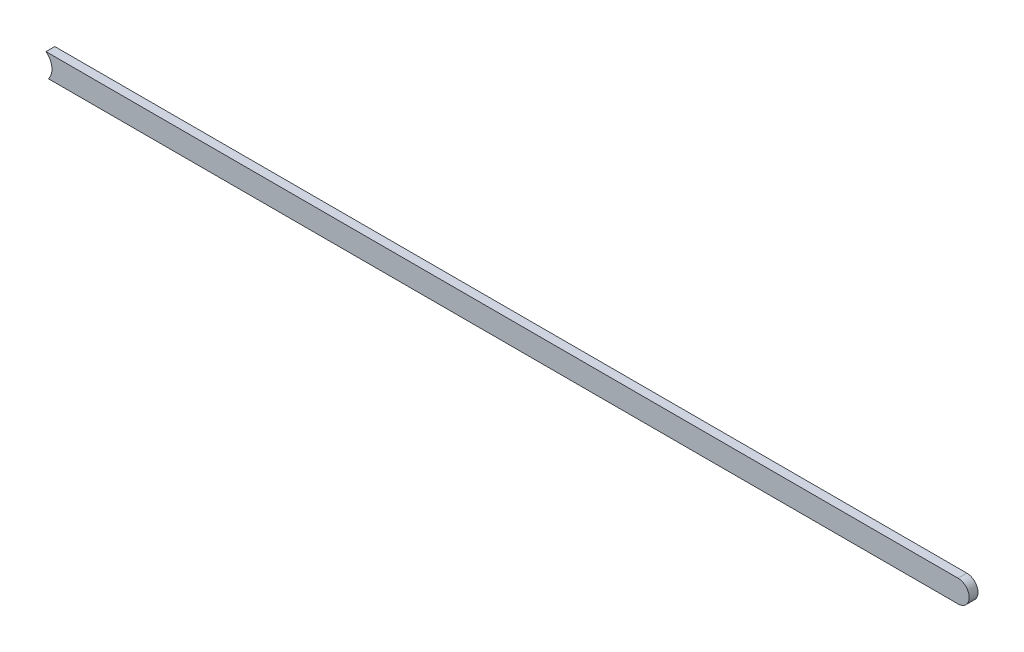
ISO-10303-21;
HEADER;
FILE_DESCRIPTION(('STEP AP214'),'2;1');
FILE_NAME('part.step','',(''),(''),'','','');
FILE_SCHEMA(('AUTOMOTIVE_DESIGN { 1 0 10303 214 1 1 1 1 }'));
ENDSEC;
DATA;
#1=APPLICATION_CONTEXT('core data for automotive mechanical design processes');
#2=APPLICATION_PROTOCOL_DEFINITION('international standard','automotive_design',2000,#1);
#3=PRODUCT_CONTEXT('',#1,'mechanical');
#4=PRODUCT('Part','Part','',(#3));
#5=PRODUCT_RELATED_PRODUCT_CATEGORY('part','',(#4));
#6=PRODUCT_DEFINITION_FORMATION('','',#4);
#7=PRODUCT_DEFINITION_CONTEXT('part definition',#1,'design');
#8=PRODUCT_DEFINITION('design','',#6,#7);
#9=PRODUCT_DEFINITION_SHAPE('','',#8);
#10=(LENGTH_UNIT() NAMED_UNIT(*) SI_UNIT(.MILLI.,.METRE.));
#11=(NAMED_UNIT(*) PLANE_ANGLE_UNIT() SI_UNIT($,.RADIAN.));
#12=(NAMED_UNIT(*) SI_UNIT($,.STERADIAN.) SOLID_ANGLE_UNIT());
#13=UNCERTAINTY_MEASURE_WITH_UNIT(LENGTH_MEASURE(1.E-05),#10,'distance_accuracy_value','');
#14=(GEOMETRIC_REPRESENTATION_CONTEXT(3) GLOBAL_UNCERTAINTY_ASSIGNED_CONTEXT((#13)) GLOBAL_UNIT_ASSIGNED_CONTEXT((#10,
#11,#12)) REPRESENTATION_CONTEXT('',''));
#15=CARTESIAN_POINT('',(0.,0.,0.));
#16=DIRECTION('',(0.,0.,1.));
#17=DIRECTION('',(1.,0.,0.));
#18=AXIS2_PLACEMENT_3D('',#15,#16,#17);
#19=CARTESIAN_POINT('',(109.111384654487,73.8124,0.));
#20=DIRECTION('',(0.,1.,0.));
#21=DIRECTION('',(1.,0.,0.));
#22=AXIS2_PLACEMENT_3D('',#19,#20,#21);
#23=PLANE('',#22);
#24=DIRECTION('',(1.,0.,0.));
#25=VECTOR('',#24,1.);
#26=CARTESIAN_POINT('',(108.8644,73.8124,0.1999996));
#27=LINE('',#26,#25);
#28=CARTESIAN_POINT('',(109.111384654487,73.8124,0.1999996));
#29=VERTEX_POINT('',#28);
#30=CARTESIAN_POINT('',(129.8194,73.8124,0.1999996));
#31=VERTEX_POINT('',#30);
#32=EDGE_CURVE('E11',#29,#31,#27,.T.);
#33=ORIENTED_EDGE('',*,*,#32,.F.);
#34=DIRECTION('',(0.,0.,1.));
#35=VECTOR('',#34,1.);
#36=CARTESIAN_POINT('',(109.111384654487,73.8124,0.));
#37=LINE('',#36,#35);
#38=CARTESIAN_POINT('',(109.111384654487,73.8124,0.));
#39=VERTEX_POINT('',#38);
#40=EDGE_CURVE('E24',#39,#29,#37,.T.);
#41=ORIENTED_EDGE('',*,*,#40,.F.);
#42=DIRECTION('',(1.,0.,0.));
#43=VECTOR('',#42,1.);
#44=CARTESIAN_POINT('',(108.8644,73.8124,0.));
#45=LINE('',#44,#43);
#46=CARTESIAN_POINT('',(129.8194,73.8124,0.));
#47=VERTEX_POINT('',#46);
#48=EDGE_CURVE('E82',#39,#47,#45,.T.);
#49=ORIENTED_EDGE('',*,*,#48,.T.);
#50=DIRECTION('',(0.,0.,1.));
#51=VECTOR('',#50,1.);
#52=CARTESIAN_POINT('',(129.8194,73.8124,0.));
#53=LINE('',#52,#51);
#54=EDGE_CURVE('E37',#47,#31,#53,.T.);
#55=ORIENTED_EDGE('',*,*,#54,.T.);
#56=EDGE_LOOP('',(#33,#41,#49,#55));
#57=FACE_BOUND('',#56,.T.);
#58=ADVANCED_FACE('F17',(#57),#23,.F.);
#59=CARTESIAN_POINT('',(129.8194,74.0664,0.));
#60=DIRECTION('',(0.,0.,-1.));
#61=DIRECTION('',(1.11896493820486E-13,-1.,0.));
#62=AXIS2_PLACEMENT_3D('',#59,#60,#61);
#63=CYLINDRICAL_SURFACE('',#62,0.25400000000001);
#64=CARTESIAN_POINT('',(129.8194,74.0664,0.1999996));
#65=DIRECTION('',(0.,0.,1.));
#66=DIRECTION('',(1.11896493820486E-13,-1.,0.));
#67=AXIS2_PLACEMENT_3D('',#64,#65,#66);
#68=CIRCLE('',#67,0.25400000000001);
#69=CARTESIAN_POINT('',(129.8194,74.3204,0.1999996));
#70=VERTEX_POINT('',#69);
#71=EDGE_CURVE('E97',#31,#70,#68,.T.);
#72=ORIENTED_EDGE('',*,*,#71,.F.);
#73=ORIENTED_EDGE('',*,*,#54,.F.);
#74=CARTESIAN_POINT('',(129.8194,74.0664,0.));
#75=DIRECTION('',(0.,0.,1.));
#76=DIRECTION('',(1.11896493820486E-13,-1.,0.));
#77=AXIS2_PLACEMENT_3D('',#74,#75,#76);
#78=CIRCLE('',#77,0.25400000000001);
#79=CARTESIAN_POINT('',(129.8194,74.3204,0.));
#80=VERTEX_POINT('',#79);
#81=EDGE_CURVE('E94',#47,#80,#78,.T.);
#82=ORIENTED_EDGE('',*,*,#81,.T.);
#83=DIRECTION('',(0.,0.,1.));
#84=VECTOR('',#83,1.);
#85=CARTESIAN_POINT('',(129.8194,74.3204,0.));
#86=LINE('',#85,#84);
#87=EDGE_CURVE('E92',#80,#70,#86,.T.);
#88=ORIENTED_EDGE('',*,*,#87,.T.);
#89=EDGE_LOOP('',(#72,#73,#82,#88));
#90=FACE_BOUND('',#89,.T.);
#91=ADVANCED_FACE('F103',(#90),#63,.T.);
#92=CARTESIAN_POINT('',(129.8194,74.3204,0.));
#93=DIRECTION('',(0.,-1.,0.));
#94=DIRECTION('',(-1.,0.,0.));
#95=AXIS2_PLACEMENT_3D('',#92,#93,#94);
#96=PLANE('',#95);
#97=DIRECTION('',(-1.,0.,0.));
#98=VECTOR('',#97,1.);
#99=CARTESIAN_POINT('',(129.8194,74.3204,0.1999996));
#100=LINE('',#99,#98);
#101=CARTESIAN_POINT('',(109.058970452561,74.3204,0.1999996));
#102=VERTEX_POINT('',#101);
#103=EDGE_CURVE('E89',#70,#102,#100,.T.);
#104=ORIENTED_EDGE('',*,*,#103,.F.);
#105=ORIENTED_EDGE('',*,*,#87,.F.);
#106=DIRECTION('',(-1.,0.,0.));
#107=VECTOR('',#106,1.);
#108=CARTESIAN_POINT('',(129.8194,74.3204,0.));
#109=LINE('',#108,#107);
#110=CARTESIAN_POINT('',(109.058970452561,74.3204,0.));
#111=VERTEX_POINT('',#110);
#112=EDGE_CURVE('E87',#80,#111,#109,.T.);
#113=ORIENTED_EDGE('',*,*,#112,.T.);
#114=DIRECTION('',(0.,0.,1.));
#115=VECTOR('',#114,1.);
#116=CARTESIAN_POINT('',(109.058970452561,74.3204,0.));
#117=LINE('',#116,#115);
#118=EDGE_CURVE('E69',#111,#102,#117,.T.);
#119=ORIENTED_EDGE('',*,*,#118,.T.);
#120=EDGE_LOOP('',(#104,#105,#113,#119));
#121=FACE_BOUND('',#120,.T.);
#122=ADVANCED_FACE('F108',(#121),#96,.F.);
#123=CARTESIAN_POINT('',(108.839,74.041,0.));
#124=DIRECTION('',(0.,0.,-1.));
#125=DIRECTION('',(1.,0.,0.));
#126=AXIS2_PLACEMENT_3D('',#123,#124,#125);
#127=CYLINDRICAL_SURFACE('',#126,0.3556);
#128=DIRECTION('',(0.,0.,1.));
#129=VECTOR('',#128,1.);
#130=CARTESIAN_POINT('',(109.1946,74.041,0.));
#131=LINE('',#130,#129);
#132=CARTESIAN_POINT('',(109.1946,74.041,0.));
#133=VERTEX_POINT('',#132);
#134=CARTESIAN_POINT('',(109.1946,74.041,0.1999996));
#135=VERTEX_POINT('',#134);
#136=EDGE_CURVE('E59',#133,#135,#131,.T.);
#137=ORIENTED_EDGE('',*,*,#136,.T.);
#138=CARTESIAN_POINT('',(108.839,74.041,0.1999996));
#139=DIRECTION('',(0.,0.,1.));
#140=DIRECTION('',(1.,0.,0.));
#141=AXIS2_PLACEMENT_3D('',#138,#139,#140);
#142=CIRCLE('',#141,0.3556);
#143=EDGE_CURVE('E70',#135,#102,#142,.T.);
#144=ORIENTED_EDGE('',*,*,#143,.T.);
#145=ORIENTED_EDGE('',*,*,#118,.F.);
#146=CARTESIAN_POINT('',(108.839,74.041,0.));
#147=DIRECTION('',(0.,0.,1.));
#148=DIRECTION('',(1.,0.,0.));
#149=AXIS2_PLACEMENT_3D('',#146,#147,#148);
#150=CIRCLE('',#149,0.3556);
#151=EDGE_CURVE('E73',#133,#111,#150,.T.);
#152=ORIENTED_EDGE('',*,*,#151,.F.);
#153=EDGE_LOOP('',(#137,#144,#145,#152));
#154=FACE_BOUND('',#153,.T.);
#155=ADVANCED_FACE('F74',(#154),#127,.F.);
#156=CARTESIAN_POINT('',(108.839,74.041,0.));
#157=DIRECTION('',(0.,0.,-1.));
#158=DIRECTION('',(1.,0.,0.));
#159=AXIS2_PLACEMENT_3D('',#156,#157,#158);
#160=CYLINDRICAL_SURFACE('',#159,0.3556);
#161=ORIENTED_EDGE('',*,*,#40,.T.);
#162=CARTESIAN_POINT('',(108.839,74.041,0.1999996));
#163=DIRECTION('',(0.,0.,1.));
#164=DIRECTION('',(1.,0.,0.));
#165=AXIS2_PLACEMENT_3D('',#162,#163,#164);
#166=CIRCLE('',#165,0.3556);
#167=EDGE_CURVE('E65',#29,#135,#166,.T.);
#168=ORIENTED_EDGE('',*,*,#167,.T.);
#169=ORIENTED_EDGE('',*,*,#136,.F.);
#170=EDGE_CURVE('E63',#39,#133,#150,.T.);
#171=ORIENTED_EDGE('',*,*,#170,.F.);
#172=EDGE_LOOP('',(#161,#168,#169,#171));
#173=FACE_BOUND('',#172,.T.);
#174=ADVANCED_FACE('F61',(#173),#160,.F.);
#175=CARTESIAN_POINT('',(108.8644,73.8124,0.));
#176=DIRECTION('',(0.,0.,-1.));
#177=DIRECTION('',(-1.,0.,0.));
#178=AXIS2_PLACEMENT_3D('',#175,#176,#177);
#179=PLANE('',#178);
#180=ORIENTED_EDGE('',*,*,#48,.F.);
#181=ORIENTED_EDGE('',*,*,#170,.T.);
#182=ORIENTED_EDGE('',*,*,#151,.T.);
#183=ORIENTED_EDGE('',*,*,#112,.F.);
#184=ORIENTED_EDGE('',*,*,#81,.F.);
#185=EDGE_LOOP('',(#180,#181,#182,#183,#184));
#186=FACE_BOUND('',#185,.T.);
#187=ADVANCED_FACE('F80',(#186),#179,.T.);
#188=CARTESIAN_POINT('',(108.8644,73.8124,0.1999996));
#189=DIRECTION('',(0.,0.,-1.));
#190=DIRECTION('',(-1.,0.,0.));
#191=AXIS2_PLACEMENT_3D('',#188,#189,#190);
#192=PLANE('',#191);
#193=ORIENTED_EDGE('',*,*,#167,.F.);
#194=ORIENTED_EDGE('',*,*,#32,.T.);
#195=ORIENTED_EDGE('',*,*,#71,.T.);
#196=ORIENTED_EDGE('',*,*,#103,.T.);
#197=ORIENTED_EDGE('',*,*,#143,.F.);
#198=EDGE_LOOP('',(#193,#194,#195,#196,#197));
#199=FACE_BOUND('',#198,.T.);
#200=ADVANCED_FACE('F106',(#199),#192,.F.);
#201=CLOSED_SHELL('',(#58,#91,#122,#155,#174,#187,#200));
#202=MANIFOLD_SOLID_BREP('B1',#201);
#203=ADVANCED_BREP_SHAPE_REPRESENTATION('',(#18,#202),#14);
#204=SHAPE_DEFINITION_REPRESENTATION(#9,#203);
ENDSEC;
END-ISO-10303-21;
